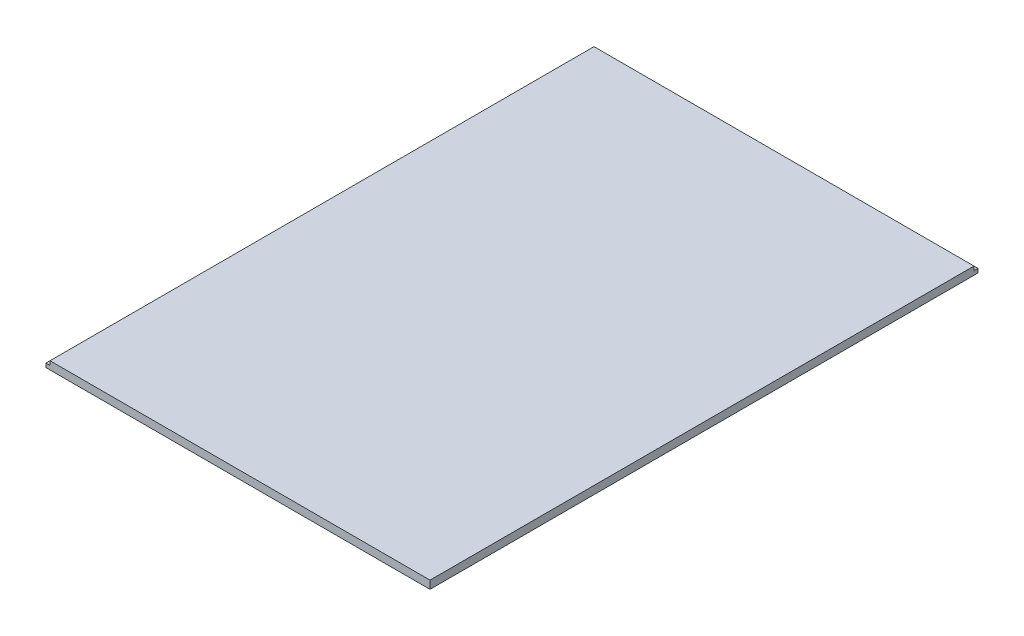
ISO-10303-21;
HEADER;
FILE_DESCRIPTION(('STEP AP214'),'2;1');
FILE_NAME('part.step','',(''),(''),'','','');
FILE_SCHEMA(('AUTOMOTIVE_DESIGN { 1 0 10303 214 1 1 1 1 }'));
ENDSEC;
DATA;
#1=APPLICATION_CONTEXT('core data for automotive mechanical design processes');
#2=APPLICATION_PROTOCOL_DEFINITION('international standard','automotive_design',2000,#1);
#3=PRODUCT_CONTEXT('',#1,'mechanical');
#4=PRODUCT('Part','Part','',(#3));
#5=PRODUCT_RELATED_PRODUCT_CATEGORY('part','',(#4));
#6=PRODUCT_DEFINITION_FORMATION('','',#4);
#7=PRODUCT_DEFINITION_CONTEXT('part definition',#1,'design');
#8=PRODUCT_DEFINITION('design','',#6,#7);
#9=PRODUCT_DEFINITION_SHAPE('','',#8);
#10=(LENGTH_UNIT() NAMED_UNIT(*) SI_UNIT(.MILLI.,.METRE.));
#11=(NAMED_UNIT(*) PLANE_ANGLE_UNIT() SI_UNIT($,.RADIAN.));
#12=(NAMED_UNIT(*) SI_UNIT($,.STERADIAN.) SOLID_ANGLE_UNIT());
#13=UNCERTAINTY_MEASURE_WITH_UNIT(LENGTH_MEASURE(1.E-05),#10,'distance_accuracy_value','');
#14=(GEOMETRIC_REPRESENTATION_CONTEXT(3) GLOBAL_UNCERTAINTY_ASSIGNED_CONTEXT((#13)) GLOBAL_UNIT_ASSIGNED_CONTEXT((#10,
#11,#12)) REPRESENTATION_CONTEXT('',''));
#15=CARTESIAN_POINT('',(0.,0.,0.));
#16=DIRECTION('',(0.,0.,1.));
#17=DIRECTION('',(1.,0.,0.));
#18=AXIS2_PLACEMENT_3D('',#15,#16,#17);
#19=CARTESIAN_POINT('',(0.,6.35,0.));
#20=DIRECTION('',(1.,0.,0.));
#21=DIRECTION('',(0.,0.,-1.));
#22=AXIS2_PLACEMENT_3D('',#19,#20,#21);
#23=PLANE('',#22);
#24=DIRECTION('',(0.,-1.,0.));
#25=VECTOR('',#24,1.);
#26=CARTESIAN_POINT('',(0.,6.35,0.));
#27=LINE('',#26,#25);
#28=CARTESIAN_POINT('',(0.,3.175,0.));
#29=VERTEX_POINT('',#28);
#30=CARTESIAN_POINT('',(0.,0.,0.));
#31=VERTEX_POINT('',#30);
#32=EDGE_CURVE('E11',#29,#31,#27,.T.);
#33=ORIENTED_EDGE('',*,*,#32,.F.);
#34=DIRECTION('',(0.,0.,1.));
#35=VECTOR('',#34,1.);
#36=CARTESIAN_POINT('',(0.,3.175,0.));
#37=LINE('',#36,#35);
#38=CARTESIAN_POINT('',(0.,3.175,-434.975));
#39=VERTEX_POINT('',#38);
#40=EDGE_CURVE('E118',#39,#29,#37,.T.);
#41=ORIENTED_EDGE('',*,*,#40,.F.);
#42=DIRECTION('',(0.,-1.,0.));
#43=VECTOR('',#42,1.);
#44=CARTESIAN_POINT('',(0.,6.35,-434.975));
#45=LINE('',#44,#43);
#46=CARTESIAN_POINT('',(0.,0.,-434.975));
#47=VERTEX_POINT('',#46);
#48=EDGE_CURVE('E85',#39,#47,#45,.T.);
#49=ORIENTED_EDGE('',*,*,#48,.T.);
#50=DIRECTION('',(0.,0.,1.));
#51=VECTOR('',#50,1.);
#52=CARTESIAN_POINT('',(0.,0.,0.));
#53=LINE('',#52,#51);
#54=EDGE_CURVE('E98',#47,#31,#53,.T.);
#55=ORIENTED_EDGE('',*,*,#54,.T.);
#56=EDGE_LOOP('',(#33,#41,#49,#55));
#57=FACE_BOUND('',#56,.T.);
#58=ADVANCED_FACE('F33',(#57),#23,.F.);
#59=CARTESIAN_POINT('',(0.,6.35,0.));
#60=DIRECTION('',(0.,0.,-1.));
#61=DIRECTION('',(-1.,0.,0.));
#62=AXIS2_PLACEMENT_3D('',#59,#60,#61);
#63=PLANE('',#62);
#64=DIRECTION('',(1.,0.,0.));
#65=VECTOR('',#64,1.);
#66=CARTESIAN_POINT('',(0.,6.35,0.));
#67=LINE('',#66,#65);
#68=CARTESIAN_POINT('',(3.17499999999993,6.35,0.));
#69=VERTEX_POINT('',#68);
#70=CARTESIAN_POINT('',(304.8,6.35,0.));
#71=VERTEX_POINT('',#70);
#72=EDGE_CURVE('E55',#69,#71,#67,.T.);
#73=ORIENTED_EDGE('',*,*,#72,.F.);
#74=DIRECTION('',(0.,1.,0.));
#75=VECTOR('',#74,1.);
#76=CARTESIAN_POINT('',(3.17499999999993,3.175,0.));
#77=LINE('',#76,#75);
#78=CARTESIAN_POINT('',(3.17499999999993,3.175,0.));
#79=VERTEX_POINT('',#78);
#80=EDGE_CURVE('E47',#79,#69,#77,.T.);
#81=ORIENTED_EDGE('',*,*,#80,.F.);
#82=DIRECTION('',(1.,0.,0.));
#83=VECTOR('',#82,1.);
#84=CARTESIAN_POINT('',(3.17499999999993,3.175,0.));
#85=LINE('',#84,#83);
#86=EDGE_CURVE('E156',#29,#79,#85,.T.);
#87=ORIENTED_EDGE('',*,*,#86,.F.);
#88=ORIENTED_EDGE('',*,*,#32,.T.);
#89=DIRECTION('',(1.,0.,0.));
#90=VECTOR('',#89,1.);
#91=CARTESIAN_POINT('',(0.,0.,0.));
#92=LINE('',#91,#90);
#93=CARTESIAN_POINT('',(304.8,0.,0.));
#94=VERTEX_POINT('',#93);
#95=EDGE_CURVE('E94',#31,#94,#92,.T.);
#96=ORIENTED_EDGE('',*,*,#95,.T.);
#97=DIRECTION('',(0.,-1.,0.));
#98=VECTOR('',#97,1.);
#99=CARTESIAN_POINT('',(304.8,6.35,0.));
#100=LINE('',#99,#98);
#101=EDGE_CURVE('E40',#71,#94,#100,.T.);
#102=ORIENTED_EDGE('',*,*,#101,.F.);
#103=EDGE_LOOP('',(#73,#81,#87,#88,#96,#102));
#104=FACE_BOUND('',#103,.T.);
#105=ADVANCED_FACE('F112',(#104),#63,.F.);
#106=CARTESIAN_POINT('',(304.8,6.35,0.));
#107=DIRECTION('',(-1.,0.,0.));
#108=DIRECTION('',(0.,0.,1.));
#109=AXIS2_PLACEMENT_3D('',#106,#107,#108);
#110=PLANE('',#109);
#111=DIRECTION('',(0.,0.,-1.));
#112=VECTOR('',#111,1.);
#113=CARTESIAN_POINT('',(304.8,3.175,-434.975));
#114=LINE('',#113,#112);
#115=CARTESIAN_POINT('',(304.8,3.175,-431.8));
#116=VERTEX_POINT('',#115);
#117=CARTESIAN_POINT('',(304.8,3.175,-434.975));
#118=VERTEX_POINT('',#117);
#119=EDGE_CURVE('E145',#116,#118,#114,.T.);
#120=ORIENTED_EDGE('',*,*,#119,.F.);
#121=DIRECTION('',(0.,1.,0.));
#122=VECTOR('',#121,1.);
#123=CARTESIAN_POINT('',(304.8,3.175,-431.8));
#124=LINE('',#123,#122);
#125=CARTESIAN_POINT('',(304.8,6.35,-431.8));
#126=VERTEX_POINT('',#125);
#127=EDGE_CURVE('E110',#116,#126,#124,.T.);
#128=ORIENTED_EDGE('',*,*,#127,.T.);
#129=DIRECTION('',(0.,0.,-1.));
#130=VECTOR('',#129,1.);
#131=CARTESIAN_POINT('',(304.8,6.35,0.));
#132=LINE('',#131,#130);
#133=EDGE_CURVE('E100',#71,#126,#132,.T.);
#134=ORIENTED_EDGE('',*,*,#133,.F.);
#135=ORIENTED_EDGE('',*,*,#101,.T.);
#136=DIRECTION('',(0.,0.,-1.));
#137=VECTOR('',#136,1.);
#138=CARTESIAN_POINT('',(304.8,0.,0.));
#139=LINE('',#138,#137);
#140=CARTESIAN_POINT('',(304.8,0.,-434.975));
#141=VERTEX_POINT('',#140);
#142=EDGE_CURVE('E89',#94,#141,#139,.T.);
#143=ORIENTED_EDGE('',*,*,#142,.T.);
#144=DIRECTION('',(0.,-1.,0.));
#145=VECTOR('',#144,1.);
#146=CARTESIAN_POINT('',(304.8,6.35,-434.975));
#147=LINE('',#146,#145);
#148=EDGE_CURVE('E74',#118,#141,#147,.T.);
#149=ORIENTED_EDGE('',*,*,#148,.F.);
#150=EDGE_LOOP('',(#120,#128,#134,#135,#143,#149));
#151=FACE_BOUND('',#150,.T.);
#152=ADVANCED_FACE('F90',(#151),#110,.F.);
#153=CARTESIAN_POINT('',(0.,6.35,-434.975));
#154=DIRECTION('',(0.,0.,1.));
#155=DIRECTION('',(1.,0.,0.));
#156=AXIS2_PLACEMENT_3D('',#153,#154,#155);
#157=PLANE('',#156);
#158=ORIENTED_EDGE('',*,*,#48,.F.);
#159=DIRECTION('',(-1.,0.,0.));
#160=VECTOR('',#159,1.);
#161=CARTESIAN_POINT('',(0.,3.175,-434.975));
#162=LINE('',#161,#160);
#163=EDGE_CURVE('E82',#118,#39,#162,.T.);
#164=ORIENTED_EDGE('',*,*,#163,.F.);
#165=ORIENTED_EDGE('',*,*,#148,.T.);
#166=DIRECTION('',(-1.,0.,0.));
#167=VECTOR('',#166,1.);
#168=CARTESIAN_POINT('',(0.,0.,-434.975));
#169=LINE('',#168,#167);
#170=EDGE_CURVE('E79',#141,#47,#169,.T.);
#171=ORIENTED_EDGE('',*,*,#170,.T.);
#172=EDGE_LOOP('',(#158,#164,#165,#171));
#173=FACE_BOUND('',#172,.T.);
#174=ADVANCED_FACE('F77',(#173),#157,.F.);
#175=CARTESIAN_POINT('',(0.,6.35,0.));
#176=DIRECTION('',(0.,-1.,0.));
#177=DIRECTION('',(0.,0.,-1.));
#178=AXIS2_PLACEMENT_3D('',#175,#176,#177);
#179=PLANE('',#178);
#180=ORIENTED_EDGE('',*,*,#133,.T.);
#181=DIRECTION('',(1.,0.,0.));
#182=VECTOR('',#181,1.);
#183=CARTESIAN_POINT('',(3.17499999999992,6.35,-431.8));
#184=LINE('',#183,#182);
#185=CARTESIAN_POINT('',(3.17499999999992,6.35,-431.8));
#186=VERTEX_POINT('',#185);
#187=EDGE_CURVE('E139',#186,#126,#184,.T.);
#188=ORIENTED_EDGE('',*,*,#187,.F.);
#189=DIRECTION('',(0.,0.,-1.));
#190=VECTOR('',#189,1.);
#191=CARTESIAN_POINT('',(3.17499999999993,6.35,0.));
#192=LINE('',#191,#190);
#193=EDGE_CURVE('E143',#69,#186,#192,.T.);
#194=ORIENTED_EDGE('',*,*,#193,.F.);
#195=ORIENTED_EDGE('',*,*,#72,.T.);
#196=EDGE_LOOP('',(#180,#188,#194,#195));
#197=FACE_BOUND('',#196,.T.);
#198=ADVANCED_FACE('F155',(#197),#179,.F.);
#199=CARTESIAN_POINT('',(0.,0.,0.));
#200=DIRECTION('',(0.,-1.,0.));
#201=DIRECTION('',(0.,0.,-1.));
#202=AXIS2_PLACEMENT_3D('',#199,#200,#201);
#203=PLANE('',#202);
#204=ORIENTED_EDGE('',*,*,#54,.F.);
#205=ORIENTED_EDGE('',*,*,#170,.F.);
#206=ORIENTED_EDGE('',*,*,#142,.F.);
#207=ORIENTED_EDGE('',*,*,#95,.F.);
#208=EDGE_LOOP('',(#204,#205,#206,#207));
#209=FACE_BOUND('',#208,.T.);
#210=ADVANCED_FACE('F96',(#209),#203,.T.);
#211=CARTESIAN_POINT('',(3.17499999999992,3.175,-431.8));
#212=DIRECTION('',(0.,0.,1.));
#213=DIRECTION('',(1.,0.,0.));
#214=AXIS2_PLACEMENT_3D('',#211,#212,#213);
#215=PLANE('',#214);
#216=ORIENTED_EDGE('',*,*,#187,.T.);
#217=ORIENTED_EDGE('',*,*,#127,.F.);
#218=DIRECTION('',(1.,0.,0.));
#219=VECTOR('',#218,1.);
#220=CARTESIAN_POINT('',(3.17499999999992,3.175,-431.8));
#221=LINE('',#220,#219);
#222=CARTESIAN_POINT('',(3.17499999999992,3.175,-431.8));
#223=VERTEX_POINT('',#222);
#224=EDGE_CURVE('E149',#223,#116,#221,.T.);
#225=ORIENTED_EDGE('',*,*,#224,.F.);
#226=DIRECTION('',(0.,1.,0.));
#227=VECTOR('',#226,1.);
#228=CARTESIAN_POINT('',(3.17499999999992,3.175,-431.8));
#229=LINE('',#228,#227);
#230=EDGE_CURVE('E138',#223,#186,#229,.T.);
#231=ORIENTED_EDGE('',*,*,#230,.T.);
#232=EDGE_LOOP('',(#216,#217,#225,#231));
#233=FACE_BOUND('',#232,.T.);
#234=ADVANCED_FACE('F141',(#233),#215,.F.);
#235=CARTESIAN_POINT('',(3.17499999999993,3.175,0.));
#236=DIRECTION('',(1.,0.,0.));
#237=DIRECTION('',(0.,0.,-1.));
#238=AXIS2_PLACEMENT_3D('',#235,#236,#237);
#239=PLANE('',#238);
#240=ORIENTED_EDGE('',*,*,#193,.T.);
#241=ORIENTED_EDGE('',*,*,#230,.F.);
#242=DIRECTION('',(0.,0.,-1.));
#243=VECTOR('',#242,1.);
#244=CARTESIAN_POINT('',(3.17499999999993,3.175,0.));
#245=LINE('',#244,#243);
#246=EDGE_CURVE('E151',#79,#223,#245,.T.);
#247=ORIENTED_EDGE('',*,*,#246,.F.);
#248=ORIENTED_EDGE('',*,*,#80,.T.);
#249=EDGE_LOOP('',(#240,#241,#247,#248));
#250=FACE_BOUND('',#249,.T.);
#251=ADVANCED_FACE('F154',(#250),#239,.F.);
#252=CARTESIAN_POINT('',(0.,3.175,0.));
#253=DIRECTION('',(0.,-1.,0.));
#254=DIRECTION('',(0.,0.,-1.));
#255=AXIS2_PLACEMENT_3D('',#252,#253,#254);
#256=PLANE('',#255);
#257=ORIENTED_EDGE('',*,*,#163,.T.);
#258=ORIENTED_EDGE('',*,*,#40,.T.);
#259=ORIENTED_EDGE('',*,*,#86,.T.);
#260=ORIENTED_EDGE('',*,*,#246,.T.);
#261=ORIENTED_EDGE('',*,*,#224,.T.);
#262=ORIENTED_EDGE('',*,*,#119,.T.);
#263=EDGE_LOOP('',(#257,#258,#259,#260,#261,#262));
#264=FACE_BOUND('',#263,.T.);
#265=ADVANCED_FACE('F161',(#264),#256,.F.);
#266=CLOSED_SHELL('',(#58,#105,#152,#174,#198,#210,#234,#251,#265));
#267=MANIFOLD_SOLID_BREP('B2',#266);
#268=ADVANCED_BREP_SHAPE_REPRESENTATION('',(#18,#267),#14);
#269=SHAPE_DEFINITION_REPRESENTATION(#9,#268);
ENDSEC;
END-ISO-10303-21;
